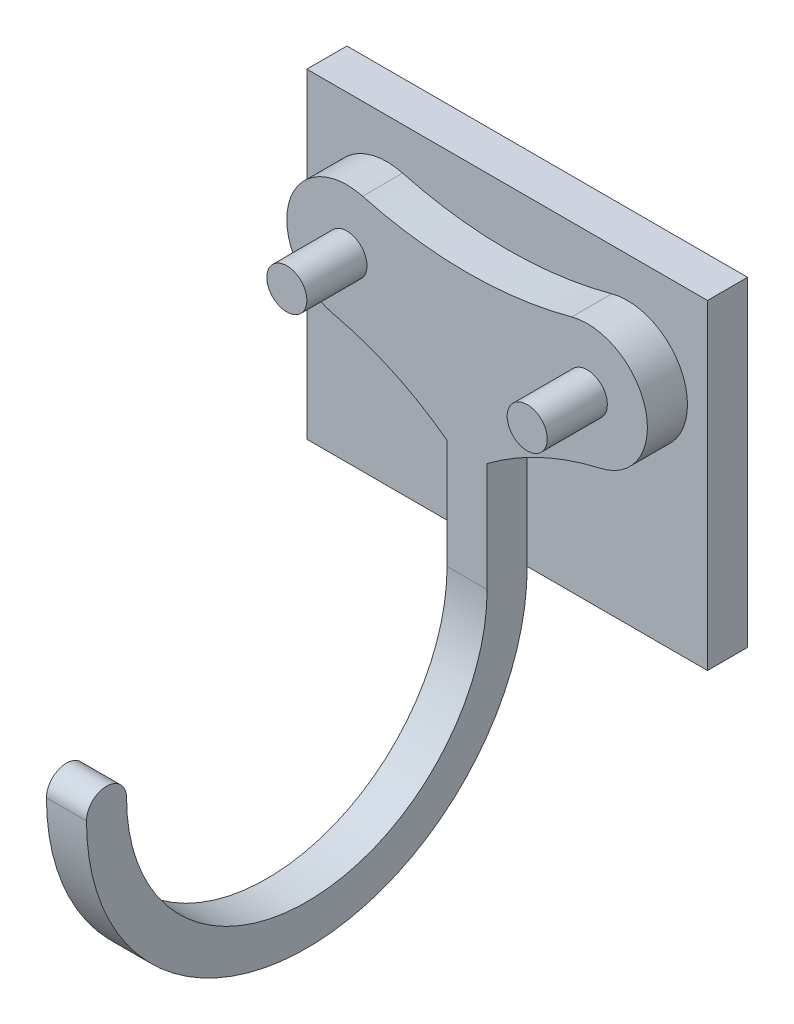
ISO-10303-21;
HEADER;
FILE_DESCRIPTION(('STEP AP214'),'2;1');
FILE_NAME('part.step','',(''),(''),'','','');
FILE_SCHEMA(('AUTOMOTIVE_DESIGN { 1 0 10303 214 1 1 1 1 }'));
ENDSEC;
DATA;
#1=APPLICATION_CONTEXT('core data for automotive mechanical design processes');
#2=APPLICATION_PROTOCOL_DEFINITION('international standard','automotive_design',2000,#1);
#3=PRODUCT_CONTEXT('',#1,'mechanical');
#4=PRODUCT('Part','Part','',(#3));
#5=PRODUCT_RELATED_PRODUCT_CATEGORY('part','',(#4));
#6=PRODUCT_DEFINITION_FORMATION('','',#4);
#7=PRODUCT_DEFINITION_CONTEXT('part definition',#1,'design');
#8=PRODUCT_DEFINITION('design','',#6,#7);
#9=PRODUCT_DEFINITION_SHAPE('','',#8);
#10=(LENGTH_UNIT() NAMED_UNIT(*) SI_UNIT(.MILLI.,.METRE.));
#11=(NAMED_UNIT(*) PLANE_ANGLE_UNIT() SI_UNIT($,.RADIAN.));
#12=(NAMED_UNIT(*) SI_UNIT($,.STERADIAN.) SOLID_ANGLE_UNIT());
#13=UNCERTAINTY_MEASURE_WITH_UNIT(LENGTH_MEASURE(1.E-05),#10,'distance_accuracy_value','');
#14=(GEOMETRIC_REPRESENTATION_CONTEXT(3) GLOBAL_UNCERTAINTY_ASSIGNED_CONTEXT((#13)) GLOBAL_UNIT_ASSIGNED_CONTEXT((#10,
#11,#12)) REPRESENTATION_CONTEXT('',''));
#15=CARTESIAN_POINT('',(0.,0.,0.));
#16=DIRECTION('',(0.,0.,1.));
#17=DIRECTION('',(1.,0.,0.));
#18=AXIS2_PLACEMENT_3D('',#15,#16,#17);
#19=CARTESIAN_POINT('',(10.,0.,2.));
#20=DIRECTION('',(-1.,0.,0.));
#21=DIRECTION('',(0.,0.,1.));
#22=AXIS2_PLACEMENT_3D('',#19,#20,#21);
#23=PLANE('',#22);
#24=DIRECTION('',(0.,1.,0.));
#25=VECTOR('',#24,1.);
#26=CARTESIAN_POINT('',(10.,0.,0.));
#27=LINE('',#26,#25);
#28=CARTESIAN_POINT('',(10.,-8.,0.));
#29=VERTEX_POINT('',#28);
#30=CARTESIAN_POINT('',(10.,8.,0.));
#31=VERTEX_POINT('',#30);
#32=EDGE_CURVE('E226',#29,#31,#27,.T.);
#33=ORIENTED_EDGE('',*,*,#32,.T.);
#34=DIRECTION('',(0.,0.,-1.));
#35=VECTOR('',#34,1.);
#36=CARTESIAN_POINT('',(10.,8.,2.));
#37=LINE('',#36,#35);
#38=CARTESIAN_POINT('',(10.,8.,2.));
#39=VERTEX_POINT('',#38);
#40=EDGE_CURVE('E43',#39,#31,#37,.T.);
#41=ORIENTED_EDGE('',*,*,#40,.F.);
#42=DIRECTION('',(0.,1.,0.));
#43=VECTOR('',#42,1.);
#44=CARTESIAN_POINT('',(10.,0.,2.));
#45=LINE('',#44,#43);
#46=CARTESIAN_POINT('',(10.,-8.,2.));
#47=VERTEX_POINT('',#46);
#48=EDGE_CURVE('E233',#47,#39,#45,.T.);
#49=ORIENTED_EDGE('',*,*,#48,.F.);
#50=DIRECTION('',(0.,0.,-1.));
#51=VECTOR('',#50,1.);
#52=CARTESIAN_POINT('',(10.,-8.,2.));
#53=LINE('',#52,#51);
#54=EDGE_CURVE('E11',#47,#29,#53,.T.);
#55=ORIENTED_EDGE('',*,*,#54,.T.);
#56=EDGE_LOOP('',(#33,#41,#49,#55));
#57=FACE_BOUND('',#56,.T.);
#58=ADVANCED_FACE('F35',(#57),#23,.F.);
#59=CARTESIAN_POINT('',(0.,8.,2.));
#60=DIRECTION('',(0.,1.,0.));
#61=DIRECTION('',(0.,0.,1.));
#62=AXIS2_PLACEMENT_3D('',#59,#60,#61);
#63=PLANE('',#62);
#64=DIRECTION('',(1.,0.,0.));
#65=VECTOR('',#64,1.);
#66=CARTESIAN_POINT('',(0.,8.,0.));
#67=LINE('',#66,#65);
#68=CARTESIAN_POINT('',(-10.,8.,0.));
#69=VERTEX_POINT('',#68);
#70=EDGE_CURVE('E259',#69,#31,#67,.T.);
#71=ORIENTED_EDGE('',*,*,#70,.F.);
#72=DIRECTION('',(0.,0.,-1.));
#73=VECTOR('',#72,1.);
#74=CARTESIAN_POINT('',(-10.,8.,2.));
#75=LINE('',#74,#73);
#76=CARTESIAN_POINT('',(-10.,8.,2.));
#77=VERTEX_POINT('',#76);
#78=EDGE_CURVE('E66',#77,#69,#75,.T.);
#79=ORIENTED_EDGE('',*,*,#78,.F.);
#80=DIRECTION('',(1.,0.,0.));
#81=VECTOR('',#80,1.);
#82=CARTESIAN_POINT('',(0.,8.,2.));
#83=LINE('',#82,#81);
#84=EDGE_CURVE('E236',#77,#39,#83,.T.);
#85=ORIENTED_EDGE('',*,*,#84,.T.);
#86=ORIENTED_EDGE('',*,*,#40,.T.);
#87=EDGE_LOOP('',(#71,#79,#85,#86));
#88=FACE_BOUND('',#87,.T.);
#89=ADVANCED_FACE('F267',(#88),#63,.T.);
#90=CARTESIAN_POINT('',(-10.,0.,2.));
#91=DIRECTION('',(-1.,0.,0.));
#92=DIRECTION('',(0.,0.,1.));
#93=AXIS2_PLACEMENT_3D('',#90,#91,#92);
#94=PLANE('',#93);
#95=DIRECTION('',(0.,1.,0.));
#96=VECTOR('',#95,1.);
#97=CARTESIAN_POINT('',(-10.,0.,0.));
#98=LINE('',#97,#96);
#99=CARTESIAN_POINT('',(-10.,-8.,0.));
#100=VERTEX_POINT('',#99);
#101=EDGE_CURVE('E256',#100,#69,#98,.T.);
#102=ORIENTED_EDGE('',*,*,#101,.F.);
#103=DIRECTION('',(0.,0.,-1.));
#104=VECTOR('',#103,1.);
#105=CARTESIAN_POINT('',(-10.,-8.,2.));
#106=LINE('',#105,#104);
#107=CARTESIAN_POINT('',(-10.,-8.,2.));
#108=VERTEX_POINT('',#107);
#109=EDGE_CURVE('E51',#108,#100,#106,.T.);
#110=ORIENTED_EDGE('',*,*,#109,.F.);
#111=DIRECTION('',(0.,1.,0.));
#112=VECTOR('',#111,1.);
#113=CARTESIAN_POINT('',(-10.,0.,2.));
#114=LINE('',#113,#112);
#115=EDGE_CURVE('E239',#108,#77,#114,.T.);
#116=ORIENTED_EDGE('',*,*,#115,.T.);
#117=ORIENTED_EDGE('',*,*,#78,.T.);
#118=EDGE_LOOP('',(#102,#110,#116,#117));
#119=FACE_BOUND('',#118,.T.);
#120=ADVANCED_FACE('F274',(#119),#94,.T.);
#121=CARTESIAN_POINT('',(0.,-8.,2.));
#122=DIRECTION('',(0.,1.,0.));
#123=DIRECTION('',(0.,0.,1.));
#124=AXIS2_PLACEMENT_3D('',#121,#122,#123);
#125=PLANE('',#124);
#126=DIRECTION('',(1.,0.,0.));
#127=VECTOR('',#126,1.);
#128=CARTESIAN_POINT('',(0.,-8.,2.));
#129=LINE('',#128,#127);
#130=CARTESIAN_POINT('',(1.,-8.,2.));
#131=VERTEX_POINT('',#130);
#132=EDGE_CURVE('E77',#131,#47,#129,.T.);
#133=ORIENTED_EDGE('',*,*,#132,.F.);
#134=DIRECTION('',(1.,0.,0.));
#135=VECTOR('',#134,1.);
#136=CARTESIAN_POINT('',(-26.0599281722833,-8.00000000000001,2.));
#137=LINE('',#136,#135);
#138=CARTESIAN_POINT('',(-1.,-8.,2.));
#139=VERTEX_POINT('',#138);
#140=EDGE_CURVE('E171',#139,#131,#137,.T.);
#141=ORIENTED_EDGE('',*,*,#140,.F.);
#142=EDGE_CURVE('E234',#108,#139,#129,.T.);
#143=ORIENTED_EDGE('',*,*,#142,.F.);
#144=ORIENTED_EDGE('',*,*,#109,.T.);
#145=DIRECTION('',(1.,0.,0.));
#146=VECTOR('',#145,1.);
#147=CARTESIAN_POINT('',(0.,-8.,0.));
#148=LINE('',#147,#146);
#149=EDGE_CURVE('E230',#100,#29,#148,.T.);
#150=ORIENTED_EDGE('',*,*,#149,.T.);
#151=ORIENTED_EDGE('',*,*,#54,.F.);
#152=EDGE_LOOP('',(#133,#141,#143,#144,#150,#151));
#153=FACE_BOUND('',#152,.T.);
#154=ADVANCED_FACE('F276',(#153),#125,.F.);
#155=CARTESIAN_POINT('',(0.,0.,2.));
#156=DIRECTION('',(0.,0.,1.));
#157=DIRECTION('',(1.,0.,0.));
#158=AXIS2_PLACEMENT_3D('',#155,#156,#157);
#159=PLANE('',#158);
#160=CARTESIAN_POINT('',(10.,-14.5499287747842,2.));
#161=DIRECTION('',(0.,0.,1.));
#162=DIRECTION('',(1.,0.,0.));
#163=AXIS2_PLACEMENT_3D('',#160,#161,#162);
#164=CIRCLE('',#163,15.);
#165=CARTESIAN_POINT('',(1.,-2.54992877478424,2.));
#166=VERTEX_POINT('',#165);
#167=CARTESIAN_POINT('',(6.66666666666667,0.0750118708692919,2.));
#168=VERTEX_POINT('',#167);
#169=EDGE_CURVE('E227',#166,#168,#164,.F.);
#170=ORIENTED_EDGE('',*,*,#169,.F.);
#171=DIRECTION('',(0.,-1.,0.));
#172=VECTOR('',#171,1.);
#173=CARTESIAN_POINT('',(1.,0.,2.));
#174=LINE('',#173,#172);
#175=EDGE_CURVE('E229',#166,#131,#174,.T.);
#176=ORIENTED_EDGE('',*,*,#175,.T.);
#177=ORIENTED_EDGE('',*,*,#132,.T.);
#178=ORIENTED_EDGE('',*,*,#48,.T.);
#179=ORIENTED_EDGE('',*,*,#84,.F.);
#180=ORIENTED_EDGE('',*,*,#115,.F.);
#181=ORIENTED_EDGE('',*,*,#142,.T.);
#182=DIRECTION('',(0.,-1.,0.));
#183=VECTOR('',#182,1.);
#184=CARTESIAN_POINT('',(-0.999999999999999,0.,2.));
#185=LINE('',#184,#183);
#186=CARTESIAN_POINT('',(-0.999999999999999,-2.54992877478424,2.));
#187=VERTEX_POINT('',#186);
#188=EDGE_CURVE('E241',#187,#139,#185,.T.);
#189=ORIENTED_EDGE('',*,*,#188,.F.);
#190=CARTESIAN_POINT('',(-10.,-14.5499287747842,2.));
#191=DIRECTION('',(0.,0.,1.));
#192=DIRECTION('',(1.,0.,0.));
#193=AXIS2_PLACEMENT_3D('',#190,#191,#192);
#194=CIRCLE('',#193,15.);
#195=CARTESIAN_POINT('',(-6.66666666666667,0.0750118708692936,2.));
#196=VERTEX_POINT('',#195);
#197=EDGE_CURVE('E244',#187,#196,#194,.T.);
#198=ORIENTED_EDGE('',*,*,#197,.T.);
#199=CARTESIAN_POINT('',(-6.,3.,2.));
#200=DIRECTION('',(0.,0.,1.));
#201=DIRECTION('',(1.,0.,0.));
#202=AXIS2_PLACEMENT_3D('',#199,#200,#201);
#203=CIRCLE('',#202,3.);
#204=CARTESIAN_POINT('',(-5.21739130434783,5.89612217102276,2.));
#205=VERTEX_POINT('',#204);
#206=EDGE_CURVE('E247',#205,#196,#203,.T.);
#207=ORIENTED_EDGE('',*,*,#206,.F.);
#208=CARTESIAN_POINT('',(0.,25.2036033111745,2.));
#209=DIRECTION('',(0.,0.,1.));
#210=DIRECTION('',(1.,0.,0.));
#211=AXIS2_PLACEMENT_3D('',#208,#209,#210);
#212=CIRCLE('',#211,20.);
#213=CARTESIAN_POINT('',(5.21739130434783,5.89612217102276,2.));
#214=VERTEX_POINT('',#213);
#215=EDGE_CURVE('E249',#205,#214,#212,.T.);
#216=ORIENTED_EDGE('',*,*,#215,.T.);
#217=CARTESIAN_POINT('',(6.,3.,2.));
#218=DIRECTION('',(0.,0.,1.));
#219=DIRECTION('',(1.,0.,0.));
#220=AXIS2_PLACEMENT_3D('',#217,#218,#219);
#221=CIRCLE('',#220,3.);
#222=EDGE_CURVE('E252',#214,#168,#221,.F.);
#223=ORIENTED_EDGE('',*,*,#222,.T.);
#224=EDGE_LOOP('',(#170,#176,#177,#178,#179,#180,#181,#189,#198,#207,#216,#223));
#225=FACE_BOUND('',#224,.T.);
#226=ADVANCED_FACE('F282',(#225),#159,.T.);
#227=CARTESIAN_POINT('',(0.,0.,0.));
#228=DIRECTION('',(0.,0.,1.));
#229=DIRECTION('',(1.,0.,0.));
#230=AXIS2_PLACEMENT_3D('',#227,#228,#229);
#231=PLANE('',#230);
#232=ORIENTED_EDGE('',*,*,#32,.F.);
#233=ORIENTED_EDGE('',*,*,#149,.F.);
#234=ORIENTED_EDGE('',*,*,#101,.T.);
#235=ORIENTED_EDGE('',*,*,#70,.T.);
#236=EDGE_LOOP('',(#232,#233,#234,#235));
#237=FACE_BOUND('',#236,.T.);
#238=ADVANCED_FACE('F273',(#237),#231,.F.);
#239=CARTESIAN_POINT('',(1.,0.,4.));
#240=DIRECTION('',(1.,0.,0.));
#241=DIRECTION('',(0.,1.,0.));
#242=AXIS2_PLACEMENT_3D('',#239,#240,#241);
#243=PLANE('',#242);
#244=DIRECTION('',(0.,-1.,0.));
#245=VECTOR('',#244,1.);
#246=CARTESIAN_POINT('',(1.,0.,4.));
#247=LINE('',#246,#245);
#248=CARTESIAN_POINT('',(1.,-2.54992877478424,4.));
#249=VERTEX_POINT('',#248);
#250=CARTESIAN_POINT('',(1.,-8.,4.));
#251=VERTEX_POINT('',#250);
#252=EDGE_CURVE('E165',#249,#251,#247,.T.);
#253=ORIENTED_EDGE('',*,*,#252,.T.);
#254=CARTESIAN_POINT('',(1.,-8.,13.));
#255=DIRECTION('',(-1.,0.,0.));
#256=DIRECTION('',(0.,-1.,0.));
#257=AXIS2_PLACEMENT_3D('',#254,#255,#256);
#258=CIRCLE('',#257,9.);
#259=CARTESIAN_POINT('',(1.,-8.,22.));
#260=VERTEX_POINT('',#259);
#261=EDGE_CURVE('E146',#251,#260,#258,.T.);
#262=ORIENTED_EDGE('',*,*,#261,.T.);
#263=CARTESIAN_POINT('',(1.,-8.,23.));
#264=DIRECTION('',(1.,0.,0.));
#265=DIRECTION('',(0.,-1.,0.));
#266=AXIS2_PLACEMENT_3D('',#263,#264,#265);
#267=CIRCLE('',#266,1.);
#268=CARTESIAN_POINT('',(1.,-8.,24.));
#269=VERTEX_POINT('',#268);
#270=EDGE_CURVE('E155',#260,#269,#267,.T.);
#271=ORIENTED_EDGE('',*,*,#270,.T.);
#272=CARTESIAN_POINT('',(1.,-8.,13.));
#273=DIRECTION('',(1.,0.,0.));
#274=DIRECTION('',(0.,-1.,0.));
#275=AXIS2_PLACEMENT_3D('',#272,#273,#274);
#276=CIRCLE('',#275,11.);
#277=EDGE_CURVE('E152',#269,#131,#276,.T.);
#278=ORIENTED_EDGE('',*,*,#277,.T.);
#279=ORIENTED_EDGE('',*,*,#175,.F.);
#280=DIRECTION('',(0.,0.,-1.));
#281=VECTOR('',#280,1.);
#282=CARTESIAN_POINT('',(1.,-2.54992877478424,4.));
#283=LINE('',#282,#281);
#284=EDGE_CURVE('E223',#249,#166,#283,.T.);
#285=ORIENTED_EDGE('',*,*,#284,.F.);
#286=EDGE_LOOP('',(#253,#262,#271,#278,#279,#285));
#287=FACE_BOUND('',#286,.T.);
#288=ADVANCED_FACE('F163',(#287),#243,.T.);
#289=CARTESIAN_POINT('',(10.,-14.5499287747842,4.));
#290=DIRECTION('',(0.,0.,-1.));
#291=DIRECTION('',(-1.,0.,0.));
#292=AXIS2_PLACEMENT_3D('',#289,#290,#291);
#293=CYLINDRICAL_SURFACE('',#292,15.);
#294=ORIENTED_EDGE('',*,*,#169,.T.);
#295=DIRECTION('',(0.,0.,-1.));
#296=VECTOR('',#295,1.);
#297=CARTESIAN_POINT('',(6.66666666666667,0.0750118708692919,4.));
#298=LINE('',#297,#296);
#299=CARTESIAN_POINT('',(6.66666666666667,0.0750118708692919,4.));
#300=VERTEX_POINT('',#299);
#301=EDGE_CURVE('E220',#300,#168,#298,.T.);
#302=ORIENTED_EDGE('',*,*,#301,.F.);
#303=CARTESIAN_POINT('',(10.,-14.5499287747842,4.));
#304=DIRECTION('',(0.,0.,1.));
#305=DIRECTION('',(1.,0.,0.));
#306=AXIS2_PLACEMENT_3D('',#303,#304,#305);
#307=CIRCLE('',#306,15.);
#308=EDGE_CURVE('E190',#249,#300,#307,.F.);
#309=ORIENTED_EDGE('',*,*,#308,.F.);
#310=ORIENTED_EDGE('',*,*,#284,.T.);
#311=EDGE_LOOP('',(#294,#302,#309,#310));
#312=FACE_BOUND('',#311,.T.);
#313=ADVANCED_FACE('F301',(#312),#293,.F.);
#314=CARTESIAN_POINT('',(6.,3.,4.));
#315=DIRECTION('',(0.,0.,-1.));
#316=DIRECTION('',(-1.,0.,0.));
#317=AXIS2_PLACEMENT_3D('',#314,#315,#316);
#318=CYLINDRICAL_SURFACE('',#317,3.);
#319=ORIENTED_EDGE('',*,*,#301,.T.);
#320=ORIENTED_EDGE('',*,*,#222,.F.);
#321=DIRECTION('',(0.,0.,-1.));
#322=VECTOR('',#321,1.);
#323=CARTESIAN_POINT('',(5.21739130434783,5.89612217102276,4.));
#324=LINE('',#323,#322);
#325=CARTESIAN_POINT('',(5.21739130434783,5.89612217102276,4.));
#326=VERTEX_POINT('',#325);
#327=EDGE_CURVE('E217',#326,#214,#324,.T.);
#328=ORIENTED_EDGE('',*,*,#327,.F.);
#329=CARTESIAN_POINT('',(6.,3.,4.));
#330=DIRECTION('',(0.,0.,1.));
#331=DIRECTION('',(1.,0.,0.));
#332=AXIS2_PLACEMENT_3D('',#329,#330,#331);
#333=CIRCLE('',#332,3.);
#334=EDGE_CURVE('E192',#326,#300,#333,.F.);
#335=ORIENTED_EDGE('',*,*,#334,.T.);
#336=EDGE_LOOP('',(#319,#320,#328,#335));
#337=FACE_BOUND('',#336,.T.);
#338=ADVANCED_FACE('F306',(#337),#318,.T.);
#339=CARTESIAN_POINT('',(0.,25.2036033111745,4.));
#340=DIRECTION('',(0.,0.,-1.));
#341=DIRECTION('',(-1.,0.,0.));
#342=AXIS2_PLACEMENT_3D('',#339,#340,#341);
#343=CYLINDRICAL_SURFACE('',#342,20.);
#344=ORIENTED_EDGE('',*,*,#327,.T.);
#345=ORIENTED_EDGE('',*,*,#215,.F.);
#346=DIRECTION('',(0.,0.,-1.));
#347=VECTOR('',#346,1.);
#348=CARTESIAN_POINT('',(-5.21739130434783,5.89612217102276,4.));
#349=LINE('',#348,#347);
#350=CARTESIAN_POINT('',(-5.21739130434783,5.89612217102276,4.));
#351=VERTEX_POINT('',#350);
#352=EDGE_CURVE('E214',#351,#205,#349,.T.);
#353=ORIENTED_EDGE('',*,*,#352,.F.);
#354=CARTESIAN_POINT('',(0.,25.2036033111745,4.));
#355=DIRECTION('',(0.,0.,1.));
#356=DIRECTION('',(1.,0.,0.));
#357=AXIS2_PLACEMENT_3D('',#354,#355,#356);
#358=CIRCLE('',#357,20.);
#359=EDGE_CURVE('E195',#351,#326,#358,.T.);
#360=ORIENTED_EDGE('',*,*,#359,.T.);
#361=EDGE_LOOP('',(#344,#345,#353,#360));
#362=FACE_BOUND('',#361,.T.);
#363=ADVANCED_FACE('F318',(#362),#343,.F.);
#364=CARTESIAN_POINT('',(-6.,3.,4.));
#365=DIRECTION('',(0.,0.,-1.));
#366=DIRECTION('',(-1.,0.,0.));
#367=AXIS2_PLACEMENT_3D('',#364,#365,#366);
#368=CYLINDRICAL_SURFACE('',#367,3.);
#369=ORIENTED_EDGE('',*,*,#206,.T.);
#370=DIRECTION('',(0.,0.,-1.));
#371=VECTOR('',#370,1.);
#372=CARTESIAN_POINT('',(-6.66666666666667,0.0750118708692936,4.));
#373=LINE('',#372,#371);
#374=CARTESIAN_POINT('',(-6.66666666666667,0.0750118708692936,4.));
#375=VERTEX_POINT('',#374);
#376=EDGE_CURVE('E211',#375,#196,#373,.T.);
#377=ORIENTED_EDGE('',*,*,#376,.F.);
#378=CARTESIAN_POINT('',(-6.,3.,4.));
#379=DIRECTION('',(0.,0.,1.));
#380=DIRECTION('',(1.,0.,0.));
#381=AXIS2_PLACEMENT_3D('',#378,#379,#380);
#382=CIRCLE('',#381,3.);
#383=EDGE_CURVE('E198',#351,#375,#382,.T.);
#384=ORIENTED_EDGE('',*,*,#383,.F.);
#385=ORIENTED_EDGE('',*,*,#352,.T.);
#386=EDGE_LOOP('',(#369,#377,#384,#385));
#387=FACE_BOUND('',#386,.T.);
#388=ADVANCED_FACE('F328',(#387),#368,.T.);
#389=CARTESIAN_POINT('',(-10.,-14.5499287747842,4.));
#390=DIRECTION('',(0.,0.,-1.));
#391=DIRECTION('',(-1.,0.,0.));
#392=AXIS2_PLACEMENT_3D('',#389,#390,#391);
#393=CYLINDRICAL_SURFACE('',#392,15.);
#394=ORIENTED_EDGE('',*,*,#376,.T.);
#395=ORIENTED_EDGE('',*,*,#197,.F.);
#396=DIRECTION('',(0.,0.,-1.));
#397=VECTOR('',#396,1.);
#398=CARTESIAN_POINT('',(-0.999999999999999,-2.54992877478424,4.));
#399=LINE('',#398,#397);
#400=CARTESIAN_POINT('',(-0.999999999999999,-2.54992877478424,4.));
#401=VERTEX_POINT('',#400);
#402=EDGE_CURVE('E208',#401,#187,#399,.T.);
#403=ORIENTED_EDGE('',*,*,#402,.F.);
#404=CARTESIAN_POINT('',(-10.,-14.5499287747842,4.));
#405=DIRECTION('',(0.,0.,1.));
#406=DIRECTION('',(1.,0.,0.));
#407=AXIS2_PLACEMENT_3D('',#404,#405,#406);
#408=CIRCLE('',#407,15.);
#409=EDGE_CURVE('E200',#401,#375,#408,.T.);
#410=ORIENTED_EDGE('',*,*,#409,.T.);
#411=EDGE_LOOP('',(#394,#395,#403,#410));
#412=FACE_BOUND('',#411,.T.);
#413=ADVANCED_FACE('F338',(#412),#393,.F.);
#414=CARTESIAN_POINT('',(-0.999999999999999,0.,4.));
#415=DIRECTION('',(1.,0.,0.));
#416=DIRECTION('',(0.,0.,-1.));
#417=AXIS2_PLACEMENT_3D('',#414,#415,#416);
#418=PLANE('',#417);
#419=ORIENTED_EDGE('',*,*,#188,.T.);
#420=CARTESIAN_POINT('',(-1.,-8.,13.));
#421=DIRECTION('',(1.,0.,0.));
#422=DIRECTION('',(0.,0.,-1.));
#423=AXIS2_PLACEMENT_3D('',#420,#421,#422);
#424=CIRCLE('',#423,11.);
#425=CARTESIAN_POINT('',(-1.,-8.,24.));
#426=VERTEX_POINT('',#425);
#427=EDGE_CURVE('E173',#139,#426,#424,.F.);
#428=ORIENTED_EDGE('',*,*,#427,.T.);
#429=CARTESIAN_POINT('',(-1.,-8.,23.));
#430=DIRECTION('',(1.,0.,0.));
#431=DIRECTION('',(0.,0.,-1.));
#432=AXIS2_PLACEMENT_3D('',#429,#430,#431);
#433=CIRCLE('',#432,1.);
#434=CARTESIAN_POINT('',(-1.,-8.,22.));
#435=VERTEX_POINT('',#434);
#436=EDGE_CURVE('E175',#426,#435,#433,.F.);
#437=ORIENTED_EDGE('',*,*,#436,.T.);
#438=CARTESIAN_POINT('',(-1.,-8.,13.));
#439=DIRECTION('',(1.,0.,0.));
#440=DIRECTION('',(0.,0.,-1.));
#441=AXIS2_PLACEMENT_3D('',#438,#439,#440);
#442=CIRCLE('',#441,9.);
#443=CARTESIAN_POINT('',(-1.,-8.,4.));
#444=VERTEX_POINT('',#443);
#445=EDGE_CURVE('E148',#435,#444,#442,.T.);
#446=ORIENTED_EDGE('',*,*,#445,.T.);
#447=DIRECTION('',(0.,-1.,0.));
#448=VECTOR('',#447,1.);
#449=CARTESIAN_POINT('',(-0.999999999999999,0.,4.));
#450=LINE('',#449,#448);
#451=EDGE_CURVE('E203',#401,#444,#450,.T.);
#452=ORIENTED_EDGE('',*,*,#451,.F.);
#453=ORIENTED_EDGE('',*,*,#402,.T.);
#454=EDGE_LOOP('',(#419,#428,#437,#446,#452,#453));
#455=FACE_BOUND('',#454,.T.);
#456=ADVANCED_FACE('F348',(#455),#418,.F.);
#457=CARTESIAN_POINT('',(0.,0.,4.));
#458=DIRECTION('',(0.,0.,1.));
#459=DIRECTION('',(1.,0.,0.));
#460=AXIS2_PLACEMENT_3D('',#457,#458,#459);
#461=PLANE('',#460);
#462=CARTESIAN_POINT('',(-6.,3.,4.));
#463=DIRECTION('',(0.,0.,1.));
#464=DIRECTION('',(1.,0.,0.));
#465=AXIS2_PLACEMENT_3D('',#462,#463,#464);
#466=CIRCLE('',#465,1.);
#467=CARTESIAN_POINT('',(-5.,3.,4.));
#468=VERTEX_POINT('',#467);
#469=EDGE_CURVE('E186',#468,#468,#466,.T.);
#470=ORIENTED_EDGE('',*,*,#469,.F.);
#471=EDGE_LOOP('',(#470));
#472=FACE_BOUND('',#471,.T.);
#473=CARTESIAN_POINT('',(6.,3.,4.));
#474=DIRECTION('',(0.,0.,1.));
#475=DIRECTION('',(1.,0.,0.));
#476=AXIS2_PLACEMENT_3D('',#473,#474,#475);
#477=CIRCLE('',#476,1.);
#478=CARTESIAN_POINT('',(7.,3.,4.));
#479=VERTEX_POINT('',#478);
#480=EDGE_CURVE('E180',#479,#479,#477,.T.);
#481=ORIENTED_EDGE('',*,*,#480,.F.);
#482=EDGE_LOOP('',(#481));
#483=FACE_BOUND('',#482,.T.);
#484=ORIENTED_EDGE('',*,*,#252,.F.);
#485=ORIENTED_EDGE('',*,*,#308,.T.);
#486=ORIENTED_EDGE('',*,*,#334,.F.);
#487=ORIENTED_EDGE('',*,*,#359,.F.);
#488=ORIENTED_EDGE('',*,*,#383,.T.);
#489=ORIENTED_EDGE('',*,*,#409,.F.);
#490=ORIENTED_EDGE('',*,*,#451,.T.);
#491=DIRECTION('',(1.,0.,0.));
#492=VECTOR('',#491,1.);
#493=CARTESIAN_POINT('',(0.,-8.,4.));
#494=LINE('',#493,#492);
#495=EDGE_CURVE('E206',#444,#251,#494,.T.);
#496=ORIENTED_EDGE('',*,*,#495,.T.);
#497=EDGE_LOOP('',(#484,#485,#486,#487,#488,#489,#490,#496));
#498=FACE_BOUND('',#497,.T.);
#499=ADVANCED_FACE('F372',(#472,#483,#498),#461,.T.);
#500=CARTESIAN_POINT('',(0.,0.,7.));
#501=DIRECTION('',(0.,0.,1.));
#502=DIRECTION('',(1.,0.,0.));
#503=AXIS2_PLACEMENT_3D('',#500,#501,#502);
#504=PLANE('',#503);
#505=CARTESIAN_POINT('',(-6.,3.,7.));
#506=DIRECTION('',(0.,0.,1.));
#507=DIRECTION('',(1.,0.,0.));
#508=AXIS2_PLACEMENT_3D('',#505,#506,#507);
#509=CIRCLE('',#508,1.);
#510=CARTESIAN_POINT('',(-5.,3.,7.));
#511=VERTEX_POINT('',#510);
#512=EDGE_CURVE('E183',#511,#511,#509,.T.);
#513=ORIENTED_EDGE('',*,*,#512,.T.);
#514=EDGE_LOOP('',(#513));
#515=FACE_BOUND('',#514,.T.);
#516=ADVANCED_FACE('F367',(#515),#504,.T.);
#517=CARTESIAN_POINT('',(-6.,3.,7.));
#518=DIRECTION('',(0.,0.,-1.));
#519=DIRECTION('',(-1.,0.,0.));
#520=AXIS2_PLACEMENT_3D('',#517,#518,#519);
#521=CYLINDRICAL_SURFACE('',#520,1.);
#522=ORIENTED_EDGE('',*,*,#469,.T.);
#523=EDGE_LOOP('',(#522));
#524=FACE_BOUND('',#523,.T.);
#525=ORIENTED_EDGE('',*,*,#512,.F.);
#526=EDGE_LOOP('',(#525));
#527=FACE_BOUND('',#526,.T.);
#528=ADVANCED_FACE('F371',(#524,#527),#521,.T.);
#529=CARTESIAN_POINT('',(0.,0.,7.));
#530=DIRECTION('',(0.,0.,1.));
#531=DIRECTION('',(1.,0.,0.));
#532=AXIS2_PLACEMENT_3D('',#529,#530,#531);
#533=PLANE('',#532);
#534=CARTESIAN_POINT('',(6.,3.,7.));
#535=DIRECTION('',(0.,0.,1.));
#536=DIRECTION('',(1.,0.,0.));
#537=AXIS2_PLACEMENT_3D('',#534,#535,#536);
#538=CIRCLE('',#537,1.);
#539=CARTESIAN_POINT('',(7.,3.,7.));
#540=VERTEX_POINT('',#539);
#541=EDGE_CURVE('E177',#540,#540,#538,.F.);
#542=ORIENTED_EDGE('',*,*,#541,.F.);
#543=EDGE_LOOP('',(#542));
#544=FACE_BOUND('',#543,.T.);
#545=ADVANCED_FACE('F383',(#544),#533,.T.);
#546=CARTESIAN_POINT('',(6.,3.,7.));
#547=DIRECTION('',(0.,0.,-1.));
#548=DIRECTION('',(-1.,0.,0.));
#549=AXIS2_PLACEMENT_3D('',#546,#547,#548);
#550=CYLINDRICAL_SURFACE('',#549,1.);
#551=ORIENTED_EDGE('',*,*,#480,.T.);
#552=EDGE_LOOP('',(#551));
#553=FACE_BOUND('',#552,.T.);
#554=ORIENTED_EDGE('',*,*,#541,.T.);
#555=EDGE_LOOP('',(#554));
#556=FACE_BOUND('',#555,.T.);
#557=ADVANCED_FACE('F393',(#553,#556),#550,.T.);
#558=CARTESIAN_POINT('',(-26.0599281722833,-8.00000000000001,13.));
#559=DIRECTION('',(1.,0.,0.));
#560=DIRECTION('',(0.,1.,0.));
#561=AXIS2_PLACEMENT_3D('',#558,#559,#560);
#562=CYLINDRICAL_SURFACE('',#561,9.);
#563=ORIENTED_EDGE('',*,*,#445,.F.);
#564=DIRECTION('',(1.,0.,0.));
#565=VECTOR('',#564,1.);
#566=CARTESIAN_POINT('',(-26.0599281722833,-8.00000000000001,22.));
#567=LINE('',#566,#565);
#568=EDGE_CURVE('E141',#435,#260,#567,.T.);
#569=ORIENTED_EDGE('',*,*,#568,.T.);
#570=ORIENTED_EDGE('',*,*,#261,.F.);
#571=ORIENTED_EDGE('',*,*,#495,.F.);
#572=EDGE_LOOP('',(#563,#569,#570,#571));
#573=FACE_BOUND('',#572,.T.);
#574=ADVANCED_FACE('F143',(#573),#562,.F.);
#575=CARTESIAN_POINT('',(-26.0599281722833,-8.00000000000001,13.));
#576=DIRECTION('',(1.,0.,0.));
#577=DIRECTION('',(0.,1.,0.));
#578=AXIS2_PLACEMENT_3D('',#575,#576,#577);
#579=CYLINDRICAL_SURFACE('',#578,11.);
#580=ORIENTED_EDGE('',*,*,#427,.F.);
#581=ORIENTED_EDGE('',*,*,#140,.T.);
#582=ORIENTED_EDGE('',*,*,#277,.F.);
#583=DIRECTION('',(1.,0.,0.));
#584=VECTOR('',#583,1.);
#585=CARTESIAN_POINT('',(-26.0599281722833,-8.00000000000001,24.));
#586=LINE('',#585,#584);
#587=EDGE_CURVE('E151',#426,#269,#586,.T.);
#588=ORIENTED_EDGE('',*,*,#587,.F.);
#589=EDGE_LOOP('',(#580,#581,#582,#588));
#590=FACE_BOUND('',#589,.T.);
#591=ADVANCED_FACE('F451',(#590),#579,.T.);
#592=CARTESIAN_POINT('',(-26.0599281722833,-8.,23.));
#593=DIRECTION('',(1.,0.,0.));
#594=DIRECTION('',(0.,1.,0.));
#595=AXIS2_PLACEMENT_3D('',#592,#593,#594);
#596=CYLINDRICAL_SURFACE('',#595,1.);
#597=ORIENTED_EDGE('',*,*,#436,.F.);
#598=ORIENTED_EDGE('',*,*,#587,.T.);
#599=ORIENTED_EDGE('',*,*,#270,.F.);
#600=ORIENTED_EDGE('',*,*,#568,.F.);
#601=EDGE_LOOP('',(#597,#598,#599,#600));
#602=FACE_BOUND('',#601,.T.);
#603=ADVANCED_FACE('F156',(#602),#596,.T.);
#604=CLOSED_SHELL('',(#58,#89,#120,#154,#226,#238,#288,#313,#338,#363,#388,#413,#456,#499,#516,
#528,#545,#557,#574,#591,#603));
#605=MANIFOLD_SOLID_BREP('B2',#604);
#606=ADVANCED_BREP_SHAPE_REPRESENTATION('',(#18,#605),#14);
#607=SHAPE_DEFINITION_REPRESENTATION(#9,#606);
ENDSEC;
END-ISO-10303-21;
